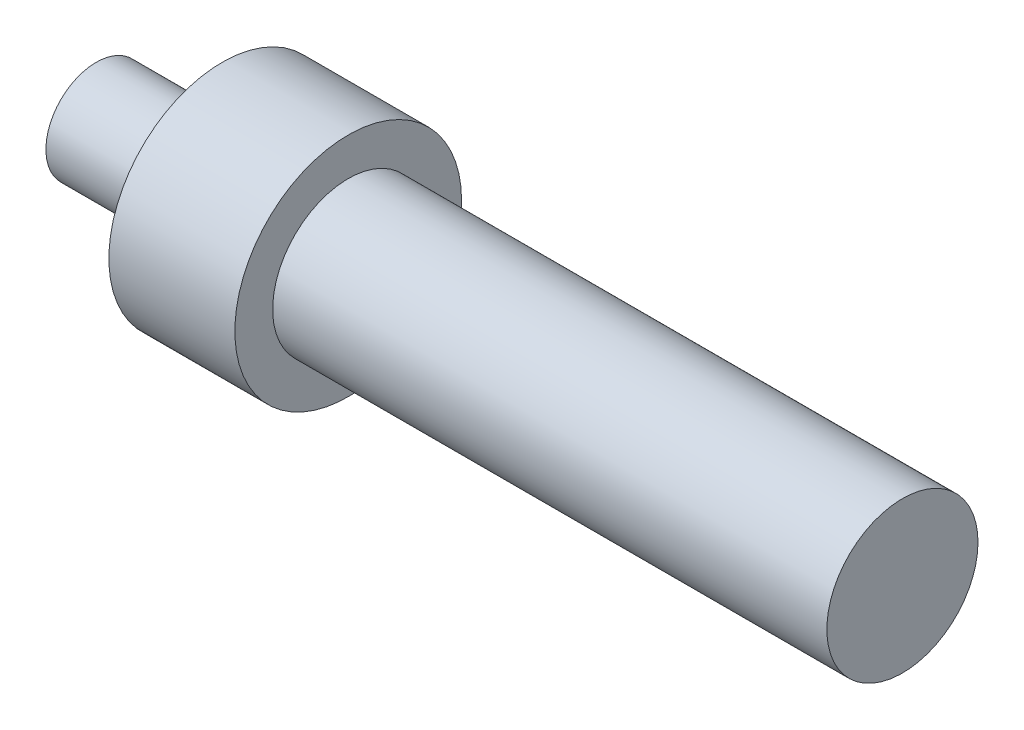
ISO-10303-21;
HEADER;
FILE_DESCRIPTION(('STEP AP214'),'2;1');
FILE_NAME('part.step','',(''),(''),'','','');
FILE_SCHEMA(('AUTOMOTIVE_DESIGN { 1 0 10303 214 1 1 1 1 }'));
ENDSEC;
DATA;
#1=APPLICATION_CONTEXT('core data for automotive mechanical design processes');
#2=APPLICATION_PROTOCOL_DEFINITION('international standard','automotive_design',2000,#1);
#3=PRODUCT_CONTEXT('',#1,'mechanical');
#4=PRODUCT('Part','Part','',(#3));
#5=PRODUCT_RELATED_PRODUCT_CATEGORY('part','',(#4));
#6=PRODUCT_DEFINITION_FORMATION('','',#4);
#7=PRODUCT_DEFINITION_CONTEXT('part definition',#1,'design');
#8=PRODUCT_DEFINITION('design','',#6,#7);
#9=PRODUCT_DEFINITION_SHAPE('','',#8);
#10=(LENGTH_UNIT() NAMED_UNIT(*) SI_UNIT(.MILLI.,.METRE.));
#11=(NAMED_UNIT(*) PLANE_ANGLE_UNIT() SI_UNIT($,.RADIAN.));
#12=(NAMED_UNIT(*) SI_UNIT($,.STERADIAN.) SOLID_ANGLE_UNIT());
#13=UNCERTAINTY_MEASURE_WITH_UNIT(LENGTH_MEASURE(1.E-05),#10,'distance_accuracy_value','');
#14=(GEOMETRIC_REPRESENTATION_CONTEXT(3) GLOBAL_UNCERTAINTY_ASSIGNED_CONTEXT((#13)) GLOBAL_UNIT_ASSIGNED_CONTEXT((#10,
#11,#12)) REPRESENTATION_CONTEXT('',''));
#15=CARTESIAN_POINT('',(0.,0.,0.));
#16=DIRECTION('',(0.,0.,1.));
#17=DIRECTION('',(1.,0.,0.));
#18=AXIS2_PLACEMENT_3D('',#15,#16,#17);
#19=CARTESIAN_POINT('',(0.,0.,0.));
#20=DIRECTION('',(-1.,0.,0.));
#21=DIRECTION('',(0.,0.,1.));
#22=AXIS2_PLACEMENT_3D('',#19,#20,#21);
#23=PLANE('',#22);
#24=CARTESIAN_POINT('',(0.,0.,0.));
#25=DIRECTION('',(1.,0.,0.));
#26=DIRECTION('',(0.,0.,-1.));
#27=AXIS2_PLACEMENT_3D('',#24,#25,#26);
#28=CIRCLE('',#27,4.);
#29=CARTESIAN_POINT('',(0.,0.,-4.));
#30=VERTEX_POINT('',#29);
#31=EDGE_CURVE('E10',#30,#30,#28,.T.);
#32=ORIENTED_EDGE('',*,*,#31,.F.);
#33=EDGE_LOOP('',(#32));
#34=FACE_BOUND('',#33,.T.);
#35=ADVANCED_FACE('F34',(#34),#23,.T.);
#36=CARTESIAN_POINT('',(0.,0.,0.));
#37=DIRECTION('',(1.,0.,0.));
#38=DIRECTION('',(0.,0.,-1.));
#39=AXIS2_PLACEMENT_3D('',#36,#37,#38);
#40=CYLINDRICAL_SURFACE('',#39,4.);
#41=ORIENTED_EDGE('',*,*,#31,.T.);
#42=EDGE_LOOP('',(#41));
#43=FACE_BOUND('',#42,.T.);
#44=CARTESIAN_POINT('',(10.,0.,0.));
#45=DIRECTION('',(1.,0.,0.));
#46=DIRECTION('',(0.,0.,-1.));
#47=AXIS2_PLACEMENT_3D('',#44,#45,#46);
#48=CIRCLE('',#47,4.);
#49=CARTESIAN_POINT('',(10.,0.,-4.));
#50=VERTEX_POINT('',#49);
#51=EDGE_CURVE('E40',#50,#50,#48,.T.);
#52=ORIENTED_EDGE('',*,*,#51,.F.);
#53=EDGE_LOOP('',(#52));
#54=FACE_BOUND('',#53,.T.);
#55=ADVANCED_FACE('F76',(#43,#54),#40,.T.);
#56=CARTESIAN_POINT('',(10.,4.,0.));
#57=DIRECTION('',(-1.,0.,0.));
#58=DIRECTION('',(0.,0.,1.));
#59=AXIS2_PLACEMENT_3D('',#56,#57,#58);
#60=PLANE('',#59);
#61=ORIENTED_EDGE('',*,*,#51,.T.);
#62=EDGE_LOOP('',(#61));
#63=FACE_BOUND('',#62,.T.);
#64=CARTESIAN_POINT('',(10.,0.,0.));
#65=DIRECTION('',(1.,0.,0.));
#66=DIRECTION('',(0.,0.,-1.));
#67=AXIS2_PLACEMENT_3D('',#64,#65,#66);
#68=CIRCLE('',#67,9.);
#69=CARTESIAN_POINT('',(10.,0.,-9.));
#70=VERTEX_POINT('',#69);
#71=EDGE_CURVE('E44',#70,#70,#68,.T.);
#72=ORIENTED_EDGE('',*,*,#71,.F.);
#73=EDGE_LOOP('',(#72));
#74=FACE_BOUND('',#73,.T.);
#75=ADVANCED_FACE('F81',(#63,#74),#60,.T.);
#76=CARTESIAN_POINT('',(0.,0.,0.));
#77=DIRECTION('',(1.,0.,0.));
#78=DIRECTION('',(0.,0.,-1.));
#79=AXIS2_PLACEMENT_3D('',#76,#77,#78);
#80=CYLINDRICAL_SURFACE('',#79,9.);
#81=ORIENTED_EDGE('',*,*,#71,.T.);
#82=EDGE_LOOP('',(#81));
#83=FACE_BOUND('',#82,.T.);
#84=CARTESIAN_POINT('',(20.,0.,0.));
#85=DIRECTION('',(1.,0.,0.));
#86=DIRECTION('',(0.,0.,-1.));
#87=AXIS2_PLACEMENT_3D('',#84,#85,#86);
#88=CIRCLE('',#87,9.);
#89=CARTESIAN_POINT('',(20.,0.,-9.));
#90=VERTEX_POINT('',#89);
#91=EDGE_CURVE('E48',#90,#90,#88,.T.);
#92=ORIENTED_EDGE('',*,*,#91,.F.);
#93=EDGE_LOOP('',(#92));
#94=FACE_BOUND('',#93,.T.);
#95=ADVANCED_FACE('F72',(#83,#94),#80,.T.);
#96=CARTESIAN_POINT('',(20.,9.,0.));
#97=DIRECTION('',(1.,0.,0.));
#98=DIRECTION('',(0.,0.,-1.));
#99=AXIS2_PLACEMENT_3D('',#96,#97,#98);
#100=PLANE('',#99);
#101=ORIENTED_EDGE('',*,*,#91,.T.);
#102=EDGE_LOOP('',(#101));
#103=FACE_BOUND('',#102,.T.);
#104=CARTESIAN_POINT('',(20.,0.,0.));
#105=DIRECTION('',(1.,0.,0.));
#106=DIRECTION('',(0.,0.,-1.));
#107=AXIS2_PLACEMENT_3D('',#104,#105,#106);
#108=CIRCLE('',#107,6.);
#109=CARTESIAN_POINT('',(20.,0.,-6.));
#110=VERTEX_POINT('',#109);
#111=EDGE_CURVE('E53',#110,#110,#108,.T.);
#112=ORIENTED_EDGE('',*,*,#111,.F.);
#113=EDGE_LOOP('',(#112));
#114=FACE_BOUND('',#113,.T.);
#115=ADVANCED_FACE('F64',(#103,#114),#100,.T.);
#116=CARTESIAN_POINT('',(0.,0.,0.));
#117=DIRECTION('',(1.,0.,0.));
#118=DIRECTION('',(0.,0.,-1.));
#119=AXIS2_PLACEMENT_3D('',#116,#117,#118);
#120=CYLINDRICAL_SURFACE('',#119,6.);
#121=ORIENTED_EDGE('',*,*,#111,.T.);
#122=EDGE_LOOP('',(#121));
#123=FACE_BOUND('',#122,.T.);
#124=CARTESIAN_POINT('',(64.,0.,0.));
#125=DIRECTION('',(1.,0.,0.));
#126=DIRECTION('',(0.,0.,-1.));
#127=AXIS2_PLACEMENT_3D('',#124,#125,#126);
#128=CIRCLE('',#127,6.);
#129=CARTESIAN_POINT('',(64.,0.,-6.));
#130=VERTEX_POINT('',#129);
#131=EDGE_CURVE('E56',#130,#130,#128,.T.);
#132=ORIENTED_EDGE('',*,*,#131,.F.);
#133=EDGE_LOOP('',(#132));
#134=FACE_BOUND('',#133,.T.);
#135=ADVANCED_FACE('F62',(#123,#134),#120,.T.);
#136=CARTESIAN_POINT('',(64.,6.,0.));
#137=DIRECTION('',(1.,0.,0.));
#138=DIRECTION('',(0.,0.,-1.));
#139=AXIS2_PLACEMENT_3D('',#136,#137,#138);
#140=PLANE('',#139);
#141=ORIENTED_EDGE('',*,*,#131,.T.);
#142=EDGE_LOOP('',(#141));
#143=FACE_BOUND('',#142,.T.);
#144=ADVANCED_FACE('F60',(#143),#140,.T.);
#145=CLOSED_SHELL('',(#35,#55,#75,#95,#115,#135,#144));
#146=MANIFOLD_SOLID_BREP('B2',#145);
#147=ADVANCED_BREP_SHAPE_REPRESENTATION('',(#18,#146),#14);
#148=SHAPE_DEFINITION_REPRESENTATION(#9,#147);
ENDSEC;
END-ISO-10303-21;
